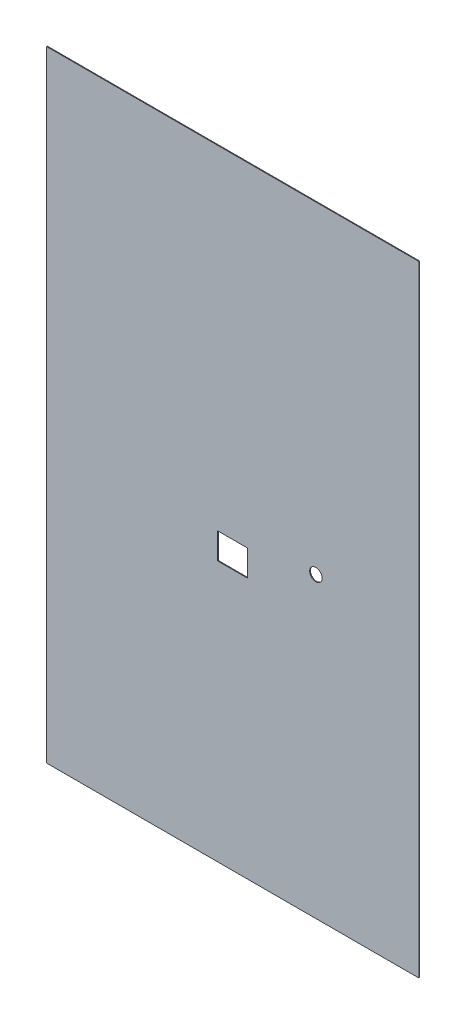
ISO-10303-21;
HEADER;
FILE_DESCRIPTION(('STEP AP214'),'2;1');
FILE_NAME('part.step','',(''),(''),'','','');
FILE_SCHEMA(('AUTOMOTIVE_DESIGN { 1 0 10303 214 1 1 1 1 }'));
ENDSEC;
DATA;
#1=APPLICATION_CONTEXT('core data for automotive mechanical design processes');
#2=APPLICATION_PROTOCOL_DEFINITION('international standard','automotive_design',2000,#1);
#3=PRODUCT_CONTEXT('',#1,'mechanical');
#4=PRODUCT('Part','Part','',(#3));
#5=PRODUCT_RELATED_PRODUCT_CATEGORY('part','',(#4));
#6=PRODUCT_DEFINITION_FORMATION('','',#4);
#7=PRODUCT_DEFINITION_CONTEXT('part definition',#1,'design');
#8=PRODUCT_DEFINITION('design','',#6,#7);
#9=PRODUCT_DEFINITION_SHAPE('','',#8);
#10=(LENGTH_UNIT() NAMED_UNIT(*) SI_UNIT(.MILLI.,.METRE.));
#11=(NAMED_UNIT(*) PLANE_ANGLE_UNIT() SI_UNIT($,.RADIAN.));
#12=(NAMED_UNIT(*) SI_UNIT($,.STERADIAN.) SOLID_ANGLE_UNIT());
#13=UNCERTAINTY_MEASURE_WITH_UNIT(LENGTH_MEASURE(1.E-05),#10,'distance_accuracy_value','');
#14=(GEOMETRIC_REPRESENTATION_CONTEXT(3) GLOBAL_UNCERTAINTY_ASSIGNED_CONTEXT((#13)) GLOBAL_UNIT_ASSIGNED_CONTEXT((#10,
#11,#12)) REPRESENTATION_CONTEXT('',''));
#15=CARTESIAN_POINT('',(0.,0.,0.));
#16=DIRECTION('',(0.,0.,1.));
#17=DIRECTION('',(1.,0.,0.));
#18=AXIS2_PLACEMENT_3D('',#15,#16,#17);
#19=CARTESIAN_POINT('',(0.,0.,3.));
#20=DIRECTION('',(1.,0.,0.));
#21=DIRECTION('',(0.,1.,0.));
#22=AXIS2_PLACEMENT_3D('',#19,#20,#21);
#23=PLANE('',#22);
#24=DIRECTION('',(0.,-1.,0.));
#25=VECTOR('',#24,1.);
#26=CARTESIAN_POINT('',(0.,0.,0.));
#27=LINE('',#26,#25);
#28=CARTESIAN_POINT('',(0.,0.,0.));
#29=VERTEX_POINT('',#28);
#30=CARTESIAN_POINT('',(3.06161699786838E-13,-2500.,0.));
#31=VERTEX_POINT('',#30);
#32=EDGE_CURVE('E135',#29,#31,#27,.T.);
#33=ORIENTED_EDGE('',*,*,#32,.T.);
#34=DIRECTION('',(0.,0.,-1.));
#35=VECTOR('',#34,1.);
#36=CARTESIAN_POINT('',(3.06161699786838E-13,-2500.,3.));
#37=LINE('',#36,#35);
#38=CARTESIAN_POINT('',(3.06161699786838E-13,-2500.,3.));
#39=VERTEX_POINT('',#38);
#40=EDGE_CURVE('E11',#39,#31,#37,.T.);
#41=ORIENTED_EDGE('',*,*,#40,.F.);
#42=DIRECTION('',(0.,-1.,0.));
#43=VECTOR('',#42,1.);
#44=CARTESIAN_POINT('',(0.,0.,3.));
#45=LINE('',#44,#43);
#46=CARTESIAN_POINT('',(0.,0.,3.));
#47=VERTEX_POINT('',#46);
#48=EDGE_CURVE('E139',#47,#39,#45,.T.);
#49=ORIENTED_EDGE('',*,*,#48,.F.);
#50=DIRECTION('',(0.,0.,-1.));
#51=VECTOR('',#50,1.);
#52=CARTESIAN_POINT('',(0.,0.,3.));
#53=LINE('',#52,#51);
#54=EDGE_CURVE('E149',#47,#29,#53,.T.);
#55=ORIENTED_EDGE('',*,*,#54,.T.);
#56=EDGE_LOOP('',(#33,#41,#49,#55));
#57=FACE_BOUND('',#56,.T.);
#58=ADVANCED_FACE('F35',(#57),#23,.F.);
#59=CARTESIAN_POINT('',(3.06161699786838E-13,-2500.,3.));
#60=DIRECTION('',(0.,1.,0.));
#61=DIRECTION('',(0.,0.,1.));
#62=AXIS2_PLACEMENT_3D('',#59,#60,#61);
#63=PLANE('',#62);
#64=DIRECTION('',(1.,0.,0.));
#65=VECTOR('',#64,1.);
#66=CARTESIAN_POINT('',(3.06161699786838E-13,-2500.,0.));
#67=LINE('',#66,#65);
#68=CARTESIAN_POINT('',(1500.,-2500.,0.));
#69=VERTEX_POINT('',#68);
#70=EDGE_CURVE('E152',#31,#69,#67,.T.);
#71=ORIENTED_EDGE('',*,*,#70,.T.);
#72=DIRECTION('',(0.,0.,-1.));
#73=VECTOR('',#72,1.);
#74=CARTESIAN_POINT('',(1500.,-2500.,3.));
#75=LINE('',#74,#73);
#76=CARTESIAN_POINT('',(1500.,-2500.,3.));
#77=VERTEX_POINT('',#76);
#78=EDGE_CURVE('E43',#77,#69,#75,.T.);
#79=ORIENTED_EDGE('',*,*,#78,.F.);
#80=DIRECTION('',(1.,0.,0.));
#81=VECTOR('',#80,1.);
#82=CARTESIAN_POINT('',(3.06161699786838E-13,-2500.,3.));
#83=LINE('',#82,#81);
#84=EDGE_CURVE('E142',#39,#77,#83,.T.);
#85=ORIENTED_EDGE('',*,*,#84,.F.);
#86=ORIENTED_EDGE('',*,*,#40,.T.);
#87=EDGE_LOOP('',(#71,#79,#85,#86));
#88=FACE_BOUND('',#87,.T.);
#89=ADVANCED_FACE('F181',(#88),#63,.F.);
#90=CARTESIAN_POINT('',(1500.,0.,3.));
#91=DIRECTION('',(-1.,0.,0.));
#92=DIRECTION('',(0.,-1.,0.));
#93=AXIS2_PLACEMENT_3D('',#90,#91,#92);
#94=PLANE('',#93);
#95=DIRECTION('',(0.,1.,0.));
#96=VECTOR('',#95,1.);
#97=CARTESIAN_POINT('',(1500.,0.,0.));
#98=LINE('',#97,#96);
#99=CARTESIAN_POINT('',(1500.,0.,0.));
#100=VERTEX_POINT('',#99);
#101=EDGE_CURVE('E154',#69,#100,#98,.T.);
#102=ORIENTED_EDGE('',*,*,#101,.T.);
#103=DIRECTION('',(0.,0.,-1.));
#104=VECTOR('',#103,1.);
#105=CARTESIAN_POINT('',(1500.,0.,3.));
#106=LINE('',#105,#104);
#107=CARTESIAN_POINT('',(1500.,0.,3.));
#108=VERTEX_POINT('',#107);
#109=EDGE_CURVE('E159',#108,#100,#106,.T.);
#110=ORIENTED_EDGE('',*,*,#109,.F.);
#111=DIRECTION('',(0.,1.,0.));
#112=VECTOR('',#111,1.);
#113=CARTESIAN_POINT('',(1500.,0.,3.));
#114=LINE('',#113,#112);
#115=EDGE_CURVE('E145',#77,#108,#114,.T.);
#116=ORIENTED_EDGE('',*,*,#115,.F.);
#117=ORIENTED_EDGE('',*,*,#78,.T.);
#118=EDGE_LOOP('',(#102,#110,#116,#117));
#119=FACE_BOUND('',#118,.T.);
#120=ADVANCED_FACE('F167',(#119),#94,.F.);
#121=CARTESIAN_POINT('',(0.,0.,3.));
#122=DIRECTION('',(0.,-1.,0.));
#123=DIRECTION('',(0.,0.,-1.));
#124=AXIS2_PLACEMENT_3D('',#121,#122,#123);
#125=PLANE('',#124);
#126=DIRECTION('',(-1.,0.,0.));
#127=VECTOR('',#126,1.);
#128=CARTESIAN_POINT('',(0.,0.,0.));
#129=LINE('',#128,#127);
#130=EDGE_CURVE('E143',#100,#29,#129,.T.);
#131=ORIENTED_EDGE('',*,*,#130,.T.);
#132=ORIENTED_EDGE('',*,*,#54,.F.);
#133=DIRECTION('',(-1.,0.,0.));
#134=VECTOR('',#133,1.);
#135=CARTESIAN_POINT('',(0.,0.,3.));
#136=LINE('',#135,#134);
#137=EDGE_CURVE('E147',#108,#47,#136,.T.);
#138=ORIENTED_EDGE('',*,*,#137,.F.);
#139=ORIENTED_EDGE('',*,*,#109,.T.);
#140=EDGE_LOOP('',(#131,#132,#138,#139));
#141=FACE_BOUND('',#140,.T.);
#142=ADVANCED_FACE('F174',(#141),#125,.F.);
#143=CARTESIAN_POINT('',(0.,0.,3.));
#144=DIRECTION('',(0.,0.,1.));
#145=DIRECTION('',(1.,0.,0.));
#146=AXIS2_PLACEMENT_3D('',#143,#144,#145);
#147=PLANE('',#146);
#148=CARTESIAN_POINT('',(1085.36790120476,-1300.,3.));
#149=DIRECTION('',(0.,0.,1.));
#150=DIRECTION('',(1.,0.,0.));
#151=AXIS2_PLACEMENT_3D('',#148,#149,#150);
#152=CIRCLE('',#151,25.);
#153=CARTESIAN_POINT('',(1110.36790120476,-1300.,3.));
#154=VERTEX_POINT('',#153);
#155=EDGE_CURVE('E124',#154,#154,#152,.T.);
#156=ORIENTED_EDGE('',*,*,#155,.F.);
#157=EDGE_LOOP('',(#156));
#158=FACE_BOUND('',#157,.T.);
#159=DIRECTION('',(0.,-1.,0.));
#160=VECTOR('',#159,1.);
#161=CARTESIAN_POINT('',(690.,-1345.,3.));
#162=LINE('',#161,#160);
#163=CARTESIAN_POINT('',(690.,-1345.,3.));
#164=VERTEX_POINT('',#163);
#165=CARTESIAN_POINT('',(690.,-1450.,3.));
#166=VERTEX_POINT('',#165);
#167=EDGE_CURVE('E50',#164,#166,#162,.T.);
#168=ORIENTED_EDGE('',*,*,#167,.F.);
#169=DIRECTION('',(-1.,0.,0.));
#170=VECTOR('',#169,1.);
#171=CARTESIAN_POINT('',(690.,-1345.,3.));
#172=LINE('',#171,#170);
#173=CARTESIAN_POINT('',(810.,-1345.,3.));
#174=VERTEX_POINT('',#173);
#175=EDGE_CURVE('E118',#174,#164,#172,.T.);
#176=ORIENTED_EDGE('',*,*,#175,.F.);
#177=DIRECTION('',(0.,1.,0.));
#178=VECTOR('',#177,1.);
#179=CARTESIAN_POINT('',(810.,-1345.,3.));
#180=LINE('',#179,#178);
#181=CARTESIAN_POINT('',(810.,-1450.,3.));
#182=VERTEX_POINT('',#181);
#183=EDGE_CURVE('E121',#182,#174,#180,.T.);
#184=ORIENTED_EDGE('',*,*,#183,.F.);
#185=DIRECTION('',(1.,0.,0.));
#186=VECTOR('',#185,1.);
#187=CARTESIAN_POINT('',(690.,-1450.,3.));
#188=LINE('',#187,#186);
#189=EDGE_CURVE('E129',#166,#182,#188,.T.);
#190=ORIENTED_EDGE('',*,*,#189,.F.);
#191=EDGE_LOOP('',(#168,#176,#184,#190));
#192=FACE_BOUND('',#191,.T.);
#193=ORIENTED_EDGE('',*,*,#48,.T.);
#194=ORIENTED_EDGE('',*,*,#84,.T.);
#195=ORIENTED_EDGE('',*,*,#115,.T.);
#196=ORIENTED_EDGE('',*,*,#137,.T.);
#197=EDGE_LOOP('',(#193,#194,#195,#196));
#198=FACE_BOUND('',#197,.T.);
#199=ADVANCED_FACE('F180',(#158,#192,#198),#147,.T.);
#200=CARTESIAN_POINT('',(0.,0.,0.));
#201=DIRECTION('',(0.,0.,1.));
#202=DIRECTION('',(1.,0.,0.));
#203=AXIS2_PLACEMENT_3D('',#200,#201,#202);
#204=PLANE('',#203);
#205=CARTESIAN_POINT('',(1085.36790120476,-1300.,0.));
#206=DIRECTION('',(0.,0.,1.));
#207=DIRECTION('',(1.,0.,0.));
#208=AXIS2_PLACEMENT_3D('',#205,#206,#207);
#209=CIRCLE('',#208,25.);
#210=CARTESIAN_POINT('',(1110.36790120476,-1300.,0.));
#211=VERTEX_POINT('',#210);
#212=EDGE_CURVE('E38',#211,#211,#209,.T.);
#213=ORIENTED_EDGE('',*,*,#212,.T.);
#214=EDGE_LOOP('',(#213));
#215=FACE_BOUND('',#214,.T.);
#216=DIRECTION('',(-1.,0.,0.));
#217=VECTOR('',#216,1.);
#218=CARTESIAN_POINT('',(690.,-1345.,0.));
#219=LINE('',#218,#217);
#220=CARTESIAN_POINT('',(810.,-1345.,0.));
#221=VERTEX_POINT('',#220);
#222=CARTESIAN_POINT('',(690.,-1345.,0.));
#223=VERTEX_POINT('',#222);
#224=EDGE_CURVE('E108',#221,#223,#219,.T.);
#225=ORIENTED_EDGE('',*,*,#224,.T.);
#226=DIRECTION('',(0.,-1.,0.));
#227=VECTOR('',#226,1.);
#228=CARTESIAN_POINT('',(690.,-1345.,0.));
#229=LINE('',#228,#227);
#230=CARTESIAN_POINT('',(690.,-1450.,0.));
#231=VERTEX_POINT('',#230);
#232=EDGE_CURVE('E102',#223,#231,#229,.T.);
#233=ORIENTED_EDGE('',*,*,#232,.T.);
#234=DIRECTION('',(1.,0.,0.));
#235=VECTOR('',#234,1.);
#236=CARTESIAN_POINT('',(690.,-1450.,0.));
#237=LINE('',#236,#235);
#238=CARTESIAN_POINT('',(810.,-1450.,0.));
#239=VERTEX_POINT('',#238);
#240=EDGE_CURVE('E111',#231,#239,#237,.T.);
#241=ORIENTED_EDGE('',*,*,#240,.T.);
#242=DIRECTION('',(0.,1.,0.));
#243=VECTOR('',#242,1.);
#244=CARTESIAN_POINT('',(810.,-1345.,0.));
#245=LINE('',#244,#243);
#246=EDGE_CURVE('E58',#239,#221,#245,.T.);
#247=ORIENTED_EDGE('',*,*,#246,.T.);
#248=EDGE_LOOP('',(#225,#233,#241,#247));
#249=FACE_BOUND('',#248,.T.);
#250=ORIENTED_EDGE('',*,*,#32,.F.);
#251=ORIENTED_EDGE('',*,*,#130,.F.);
#252=ORIENTED_EDGE('',*,*,#101,.F.);
#253=ORIENTED_EDGE('',*,*,#70,.F.);
#254=EDGE_LOOP('',(#250,#251,#252,#253));
#255=FACE_BOUND('',#254,.T.);
#256=ADVANCED_FACE('F115',(#215,#249,#255),#204,.F.);
#257=CARTESIAN_POINT('',(690.,-1345.,0.));
#258=DIRECTION('',(-1.,0.,0.));
#259=DIRECTION('',(0.,0.,1.));
#260=AXIS2_PLACEMENT_3D('',#257,#258,#259);
#261=PLANE('',#260);
#262=ORIENTED_EDGE('',*,*,#167,.T.);
#263=DIRECTION('',(0.,0.,1.));
#264=VECTOR('',#263,1.);
#265=CARTESIAN_POINT('',(690.,-1450.,0.));
#266=LINE('',#265,#264);
#267=EDGE_CURVE('E98',#231,#166,#266,.T.);
#268=ORIENTED_EDGE('',*,*,#267,.F.);
#269=ORIENTED_EDGE('',*,*,#232,.F.);
#270=DIRECTION('',(0.,0.,1.));
#271=VECTOR('',#270,1.);
#272=CARTESIAN_POINT('',(690.,-1345.,0.));
#273=LINE('',#272,#271);
#274=EDGE_CURVE('E133',#223,#164,#273,.T.);
#275=ORIENTED_EDGE('',*,*,#274,.T.);
#276=EDGE_LOOP('',(#262,#268,#269,#275));
#277=FACE_BOUND('',#276,.T.);
#278=ADVANCED_FACE('F100',(#277),#261,.F.);
#279=CARTESIAN_POINT('',(690.,-1345.,0.));
#280=DIRECTION('',(0.,1.,0.));
#281=DIRECTION('',(0.,0.,1.));
#282=AXIS2_PLACEMENT_3D('',#279,#280,#281);
#283=PLANE('',#282);
#284=ORIENTED_EDGE('',*,*,#175,.T.);
#285=ORIENTED_EDGE('',*,*,#274,.F.);
#286=ORIENTED_EDGE('',*,*,#224,.F.);
#287=DIRECTION('',(0.,0.,1.));
#288=VECTOR('',#287,1.);
#289=CARTESIAN_POINT('',(810.,-1345.,0.));
#290=LINE('',#289,#288);
#291=EDGE_CURVE('E136',#221,#174,#290,.T.);
#292=ORIENTED_EDGE('',*,*,#291,.T.);
#293=EDGE_LOOP('',(#284,#285,#286,#292));
#294=FACE_BOUND('',#293,.T.);
#295=ADVANCED_FACE('F199',(#294),#283,.F.);
#296=CARTESIAN_POINT('',(810.,-1345.,0.));
#297=DIRECTION('',(1.,0.,0.));
#298=DIRECTION('',(0.,0.,-1.));
#299=AXIS2_PLACEMENT_3D('',#296,#297,#298);
#300=PLANE('',#299);
#301=ORIENTED_EDGE('',*,*,#183,.T.);
#302=ORIENTED_EDGE('',*,*,#291,.F.);
#303=ORIENTED_EDGE('',*,*,#246,.F.);
#304=DIRECTION('',(0.,0.,1.));
#305=VECTOR('',#304,1.);
#306=CARTESIAN_POINT('',(810.,-1450.,0.));
#307=LINE('',#306,#305);
#308=EDGE_CURVE('E107',#239,#182,#307,.T.);
#309=ORIENTED_EDGE('',*,*,#308,.T.);
#310=EDGE_LOOP('',(#301,#302,#303,#309));
#311=FACE_BOUND('',#310,.T.);
#312=ADVANCED_FACE('F203',(#311),#300,.F.);
#313=CARTESIAN_POINT('',(690.,-1450.,0.));
#314=DIRECTION('',(0.,-1.,0.));
#315=DIRECTION('',(0.,0.,-1.));
#316=AXIS2_PLACEMENT_3D('',#313,#314,#315);
#317=PLANE('',#316);
#318=ORIENTED_EDGE('',*,*,#189,.T.);
#319=ORIENTED_EDGE('',*,*,#308,.F.);
#320=ORIENTED_EDGE('',*,*,#240,.F.);
#321=ORIENTED_EDGE('',*,*,#267,.T.);
#322=EDGE_LOOP('',(#318,#319,#320,#321));
#323=FACE_BOUND('',#322,.T.);
#324=ADVANCED_FACE('F112',(#323),#317,.F.);
#325=CARTESIAN_POINT('',(1085.36790120476,-1300.,-297.));
#326=DIRECTION('',(0.,0.,1.));
#327=DIRECTION('',(1.,0.,0.));
#328=AXIS2_PLACEMENT_3D('',#325,#326,#327);
#329=CYLINDRICAL_SURFACE('',#328,25.);
#330=ORIENTED_EDGE('',*,*,#155,.T.);
#331=EDGE_LOOP('',(#330));
#332=FACE_BOUND('',#331,.T.);
#333=ORIENTED_EDGE('',*,*,#212,.F.);
#334=EDGE_LOOP('',(#333));
#335=FACE_BOUND('',#334,.T.);
#336=ADVANCED_FACE('F202',(#332,#335),#329,.F.);
#337=CLOSED_SHELL('',(#58,#89,#120,#142,#199,#256,#278,#295,#312,#324,#336));
#338=MANIFOLD_SOLID_BREP('B2',#337);
#339=ADVANCED_BREP_SHAPE_REPRESENTATION('',(#18,#338),#14);
#340=SHAPE_DEFINITION_REPRESENTATION(#9,#339);
ENDSEC;
END-ISO-10303-21;
